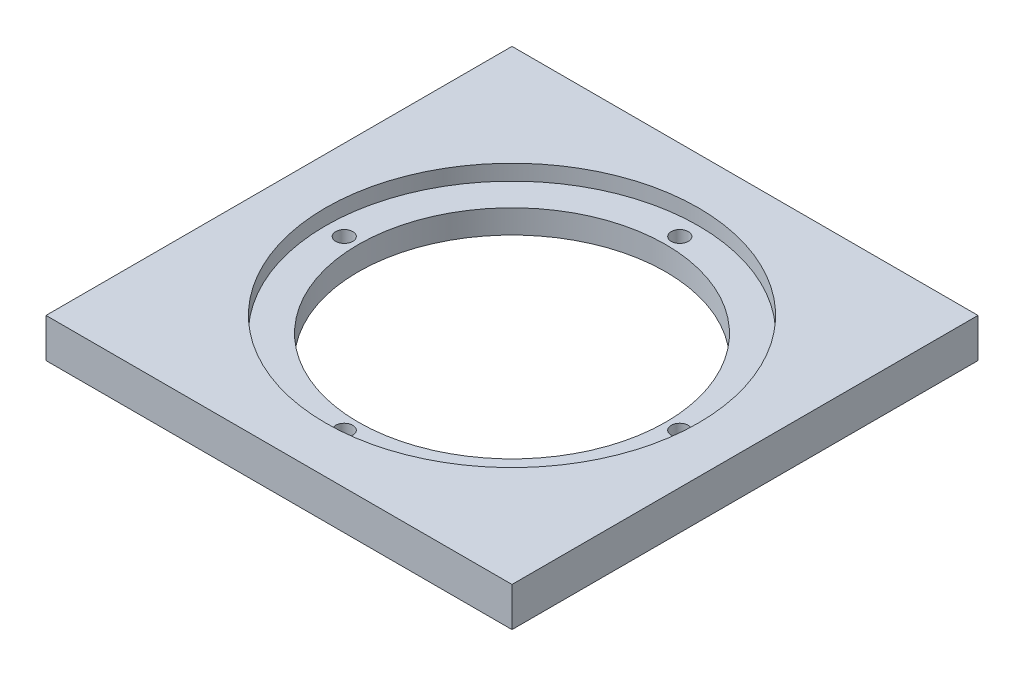
ISO-10303-21;
HEADER;
FILE_DESCRIPTION(('STEP AP214'),'2;1');
FILE_NAME('part.step','',(''),(''),'','','');
FILE_SCHEMA(('AUTOMOTIVE_DESIGN { 1 0 10303 214 1 1 1 1 }'));
ENDSEC;
DATA;
#1=APPLICATION_CONTEXT('core data for automotive mechanical design processes');
#2=APPLICATION_PROTOCOL_DEFINITION('international standard','automotive_design',2000,#1);
#3=PRODUCT_CONTEXT('',#1,'mechanical');
#4=PRODUCT('Part','Part','',(#3));
#5=PRODUCT_RELATED_PRODUCT_CATEGORY('part','',(#4));
#6=PRODUCT_DEFINITION_FORMATION('','',#4);
#7=PRODUCT_DEFINITION_CONTEXT('part definition',#1,'design');
#8=PRODUCT_DEFINITION('design','',#6,#7);
#9=PRODUCT_DEFINITION_SHAPE('','',#8);
#10=(LENGTH_UNIT() NAMED_UNIT(*) SI_UNIT(.MILLI.,.METRE.));
#11=(NAMED_UNIT(*) PLANE_ANGLE_UNIT() SI_UNIT($,.RADIAN.));
#12=(NAMED_UNIT(*) SI_UNIT($,.STERADIAN.) SOLID_ANGLE_UNIT());
#13=UNCERTAINTY_MEASURE_WITH_UNIT(LENGTH_MEASURE(1.E-05),#10,'distance_accuracy_value','');
#14=(GEOMETRIC_REPRESENTATION_CONTEXT(3) GLOBAL_UNCERTAINTY_ASSIGNED_CONTEXT((#13)) GLOBAL_UNIT_ASSIGNED_CONTEXT((#10,
#11,#12)) REPRESENTATION_CONTEXT('',''));
#15=CARTESIAN_POINT('',(0.,0.,0.));
#16=DIRECTION('',(0.,0.,1.));
#17=DIRECTION('',(1.,0.,0.));
#18=AXIS2_PLACEMENT_3D('',#15,#16,#17);
#19=CARTESIAN_POINT('',(0.,-12.5984,0.));
#20=DIRECTION('',(0.,1.,0.));
#21=DIRECTION('',(0.,0.,1.));
#22=AXIS2_PLACEMENT_3D('',#19,#20,#21);
#23=CYLINDRICAL_SURFACE('',#22,49.5);
#24=CARTESIAN_POINT('',(0.,-12.5984,0.));
#25=DIRECTION('',(0.,1.,0.));
#26=DIRECTION('',(0.,0.,1.));
#27=AXIS2_PLACEMENT_3D('',#24,#25,#26);
#28=CIRCLE('',#27,49.5);
#29=CARTESIAN_POINT('',(0.,-12.5984,49.5));
#30=VERTEX_POINT('',#29);
#31=EDGE_CURVE('E122',#30,#30,#28,.T.);
#32=ORIENTED_EDGE('',*,*,#31,.F.);
#33=EDGE_LOOP('',(#32));
#34=FACE_BOUND('',#33,.T.);
#35=CARTESIAN_POINT('',(0.,-5.,0.));
#36=DIRECTION('',(0.,1.,0.));
#37=DIRECTION('',(0.,0.,1.));
#38=AXIS2_PLACEMENT_3D('',#35,#36,#37);
#39=CIRCLE('',#38,49.5);
#40=CARTESIAN_POINT('',(0.,-5.,49.5));
#41=VERTEX_POINT('',#40);
#42=EDGE_CURVE('E134',#41,#41,#39,.F.);
#43=ORIENTED_EDGE('',*,*,#42,.F.);
#44=EDGE_LOOP('',(#43));
#45=FACE_BOUND('',#44,.T.);
#46=ADVANCED_FACE('F42',(#34,#45),#23,.F.);
#47=CARTESIAN_POINT('',(75.,-12.5984,75.));
#48=DIRECTION('',(1.,0.,0.));
#49=DIRECTION('',(0.,0.,-1.));
#50=AXIS2_PLACEMENT_3D('',#47,#48,#49);
#51=PLANE('',#50);
#52=DIRECTION('',(0.,0.,-1.));
#53=VECTOR('',#52,1.);
#54=CARTESIAN_POINT('',(75.,0.,75.));
#55=LINE('',#54,#53);
#56=CARTESIAN_POINT('',(75.,0.,75.));
#57=VERTEX_POINT('',#56);
#58=CARTESIAN_POINT('',(75.,0.,-75.0000000000001));
#59=VERTEX_POINT('',#58);
#60=EDGE_CURVE('E117',#57,#59,#55,.T.);
#61=ORIENTED_EDGE('',*,*,#60,.F.);
#62=DIRECTION('',(0.,1.,0.));
#63=VECTOR('',#62,1.);
#64=CARTESIAN_POINT('',(75.,-12.5984,75.));
#65=LINE('',#64,#63);
#66=CARTESIAN_POINT('',(75.,-12.5984,75.));
#67=VERTEX_POINT('',#66);
#68=EDGE_CURVE('E11',#67,#57,#65,.T.);
#69=ORIENTED_EDGE('',*,*,#68,.F.);
#70=DIRECTION('',(0.,0.,-1.));
#71=VECTOR('',#70,1.);
#72=CARTESIAN_POINT('',(75.,-12.5984,75.));
#73=LINE('',#72,#71);
#74=CARTESIAN_POINT('',(75.,-12.5984,-75.0000000000001));
#75=VERTEX_POINT('',#74);
#76=EDGE_CURVE('E107',#67,#75,#73,.T.);
#77=ORIENTED_EDGE('',*,*,#76,.T.);
#78=DIRECTION('',(0.,1.,0.));
#79=VECTOR('',#78,1.);
#80=CARTESIAN_POINT('',(75.,-12.5984,-75.0000000000001));
#81=LINE('',#80,#79);
#82=EDGE_CURVE('E87',#75,#59,#81,.T.);
#83=ORIENTED_EDGE('',*,*,#82,.T.);
#84=EDGE_LOOP('',(#61,#69,#77,#83));
#85=FACE_BOUND('',#84,.T.);
#86=ADVANCED_FACE('F44',(#85),#51,.T.);
#87=CARTESIAN_POINT('',(-75.,-12.5984,75.));
#88=DIRECTION('',(0.,0.,1.));
#89=DIRECTION('',(1.,0.,0.));
#90=AXIS2_PLACEMENT_3D('',#87,#88,#89);
#91=PLANE('',#90);
#92=DIRECTION('',(1.,0.,0.));
#93=VECTOR('',#92,1.);
#94=CARTESIAN_POINT('',(-75.,0.,75.));
#95=LINE('',#94,#93);
#96=CARTESIAN_POINT('',(-75.,0.,75.));
#97=VERTEX_POINT('',#96);
#98=EDGE_CURVE('E111',#97,#57,#95,.T.);
#99=ORIENTED_EDGE('',*,*,#98,.F.);
#100=DIRECTION('',(0.,1.,0.));
#101=VECTOR('',#100,1.);
#102=CARTESIAN_POINT('',(-75.,-12.5984,75.));
#103=LINE('',#102,#101);
#104=CARTESIAN_POINT('',(-75.,-12.5984,75.));
#105=VERTEX_POINT('',#104);
#106=EDGE_CURVE('E53',#105,#97,#103,.T.);
#107=ORIENTED_EDGE('',*,*,#106,.F.);
#108=DIRECTION('',(1.,0.,0.));
#109=VECTOR('',#108,1.);
#110=CARTESIAN_POINT('',(-75.,-12.5984,75.));
#111=LINE('',#110,#109);
#112=EDGE_CURVE('E102',#105,#67,#111,.T.);
#113=ORIENTED_EDGE('',*,*,#112,.T.);
#114=ORIENTED_EDGE('',*,*,#68,.T.);
#115=EDGE_LOOP('',(#99,#107,#113,#114));
#116=FACE_BOUND('',#115,.T.);
#117=ADVANCED_FACE('F202',(#116),#91,.T.);
#118=CARTESIAN_POINT('',(-75.,-12.5984,75.));
#119=DIRECTION('',(-1.,0.,0.));
#120=DIRECTION('',(0.,0.,1.));
#121=AXIS2_PLACEMENT_3D('',#118,#119,#120);
#122=PLANE('',#121);
#123=DIRECTION('',(0.,0.,1.));
#124=VECTOR('',#123,1.);
#125=CARTESIAN_POINT('',(-75.,0.,75.));
#126=LINE('',#125,#124);
#127=CARTESIAN_POINT('',(-74.9999999999999,0.,-75.));
#128=VERTEX_POINT('',#127);
#129=EDGE_CURVE('E95',#128,#97,#126,.T.);
#130=ORIENTED_EDGE('',*,*,#129,.F.);
#131=DIRECTION('',(0.,1.,0.));
#132=VECTOR('',#131,1.);
#133=CARTESIAN_POINT('',(-74.9999999999999,-12.5984,-75.));
#134=LINE('',#133,#132);
#135=CARTESIAN_POINT('',(-74.9999999999999,-12.5984,-75.));
#136=VERTEX_POINT('',#135);
#137=EDGE_CURVE('E90',#136,#128,#134,.T.);
#138=ORIENTED_EDGE('',*,*,#137,.F.);
#139=DIRECTION('',(0.,0.,1.));
#140=VECTOR('',#139,1.);
#141=CARTESIAN_POINT('',(-75.,-12.5984,75.));
#142=LINE('',#141,#140);
#143=EDGE_CURVE('E93',#136,#105,#142,.T.);
#144=ORIENTED_EDGE('',*,*,#143,.T.);
#145=ORIENTED_EDGE('',*,*,#106,.T.);
#146=EDGE_LOOP('',(#130,#138,#144,#145));
#147=FACE_BOUND('',#146,.T.);
#148=ADVANCED_FACE('F92',(#147),#122,.T.);
#149=CARTESIAN_POINT('',(-74.9999999999999,-12.5984,-75.));
#150=DIRECTION('',(0.,0.,-1.));
#151=DIRECTION('',(-1.,0.,0.));
#152=AXIS2_PLACEMENT_3D('',#149,#150,#151);
#153=PLANE('',#152);
#154=DIRECTION('',(-1.,0.,0.));
#155=VECTOR('',#154,1.);
#156=CARTESIAN_POINT('',(-74.9999999999999,0.,-75.));
#157=LINE('',#156,#155);
#158=EDGE_CURVE('E121',#59,#128,#157,.T.);
#159=ORIENTED_EDGE('',*,*,#158,.F.);
#160=ORIENTED_EDGE('',*,*,#82,.F.);
#161=DIRECTION('',(-1.,0.,0.));
#162=VECTOR('',#161,1.);
#163=CARTESIAN_POINT('',(-74.9999999999999,-12.5984,-75.));
#164=LINE('',#163,#162);
#165=EDGE_CURVE('E101',#75,#136,#164,.T.);
#166=ORIENTED_EDGE('',*,*,#165,.T.);
#167=ORIENTED_EDGE('',*,*,#137,.T.);
#168=EDGE_LOOP('',(#159,#160,#166,#167));
#169=FACE_BOUND('',#168,.T.);
#170=ADVANCED_FACE('F105',(#169),#153,.T.);
#171=CARTESIAN_POINT('',(0.,-12.5984,0.));
#172=DIRECTION('',(0.,-1.,0.));
#173=DIRECTION('',(0.,0.,-1.));
#174=AXIS2_PLACEMENT_3D('',#171,#172,#173);
#175=PLANE('',#174);
#176=CARTESIAN_POINT('',(-54.,-12.5984,0.));
#177=DIRECTION('',(0.,1.,0.));
#178=DIRECTION('',(0.,0.,1.));
#179=AXIS2_PLACEMENT_3D('',#176,#177,#178);
#180=CIRCLE('',#179,2.75);
#181=CARTESIAN_POINT('',(-54.,-12.5984,2.75000000000001));
#182=VERTEX_POINT('',#181);
#183=EDGE_CURVE('E144',#182,#182,#180,.T.);
#184=ORIENTED_EDGE('',*,*,#183,.T.);
#185=EDGE_LOOP('',(#184));
#186=FACE_BOUND('',#185,.T.);
#187=CARTESIAN_POINT('',(2.4980018054066E-13,-12.5984,-54.));
#188=DIRECTION('',(0.,1.,0.));
#189=DIRECTION('',(0.,0.,1.));
#190=AXIS2_PLACEMENT_3D('',#187,#188,#189);
#191=CIRCLE('',#190,2.75);
#192=CARTESIAN_POINT('',(2.49189557877116E-13,-12.5984,-51.25));
#193=VERTEX_POINT('',#192);
#194=EDGE_CURVE('E279',#193,#193,#191,.T.);
#195=ORIENTED_EDGE('',*,*,#194,.T.);
#196=EDGE_LOOP('',(#195));
#197=FACE_BOUND('',#196,.T.);
#198=CARTESIAN_POINT('',(54.,-12.5984,3.88578058618805E-13));
#199=DIRECTION('',(0.,1.,0.));
#200=DIRECTION('',(0.,0.,1.));
#201=AXIS2_PLACEMENT_3D('',#198,#199,#200);
#202=CIRCLE('',#201,2.75);
#203=CARTESIAN_POINT('',(54.,-12.5984,2.75000000000039));
#204=VERTEX_POINT('',#203);
#205=EDGE_CURVE('E284',#204,#204,#202,.T.);
#206=ORIENTED_EDGE('',*,*,#205,.T.);
#207=EDGE_LOOP('',(#206));
#208=FACE_BOUND('',#207,.T.);
#209=CARTESIAN_POINT('',(-5.55111512312578E-13,-12.5984,54.));
#210=DIRECTION('',(0.,1.,0.));
#211=DIRECTION('',(0.,0.,1.));
#212=AXIS2_PLACEMENT_3D('',#209,#210,#211);
#213=CIRCLE('',#212,2.75);
#214=CARTESIAN_POINT('',(-5.55722134976122E-13,-12.5984,56.75));
#215=VERTEX_POINT('',#214);
#216=EDGE_CURVE('E289',#215,#215,#213,.T.);
#217=ORIENTED_EDGE('',*,*,#216,.T.);
#218=EDGE_LOOP('',(#217));
#219=FACE_BOUND('',#218,.T.);
#220=ORIENTED_EDGE('',*,*,#31,.T.);
#221=EDGE_LOOP('',(#220));
#222=FACE_BOUND('',#221,.T.);
#223=ORIENTED_EDGE('',*,*,#76,.F.);
#224=ORIENTED_EDGE('',*,*,#112,.F.);
#225=ORIENTED_EDGE('',*,*,#143,.F.);
#226=ORIENTED_EDGE('',*,*,#165,.F.);
#227=EDGE_LOOP('',(#223,#224,#225,#226));
#228=FACE_BOUND('',#227,.T.);
#229=ADVANCED_FACE('F100',(#186,#197,#208,#219,#222,#228),#175,.T.);
#230=CARTESIAN_POINT('',(0.,0.,0.));
#231=DIRECTION('',(0.,-1.,0.));
#232=DIRECTION('',(0.,0.,-1.));
#233=AXIS2_PLACEMENT_3D('',#230,#231,#232);
#234=PLANE('',#233);
#235=CARTESIAN_POINT('',(0.,0.,0.));
#236=DIRECTION('',(0.,1.,0.));
#237=DIRECTION('',(0.,0.,1.));
#238=AXIS2_PLACEMENT_3D('',#235,#236,#237);
#239=CIRCLE('',#238,60.);
#240=CARTESIAN_POINT('',(0.,0.,60.));
#241=VERTEX_POINT('',#240);
#242=EDGE_CURVE('E155',#241,#241,#239,.T.);
#243=ORIENTED_EDGE('',*,*,#242,.F.);
#244=EDGE_LOOP('',(#243));
#245=FACE_BOUND('',#244,.T.);
#246=ORIENTED_EDGE('',*,*,#60,.T.);
#247=ORIENTED_EDGE('',*,*,#158,.T.);
#248=ORIENTED_EDGE('',*,*,#129,.T.);
#249=ORIENTED_EDGE('',*,*,#98,.T.);
#250=EDGE_LOOP('',(#246,#247,#248,#249));
#251=FACE_BOUND('',#250,.T.);
#252=ADVANCED_FACE('F183',(#245,#251),#234,.F.);
#253=CARTESIAN_POINT('',(0.,-5.00000000000001,0.));
#254=DIRECTION('',(0.,1.,0.));
#255=DIRECTION('',(0.,0.,1.));
#256=AXIS2_PLACEMENT_3D('',#253,#254,#255);
#257=PLANE('',#256);
#258=CARTESIAN_POINT('',(-54.,-5.,0.));
#259=DIRECTION('',(0.,1.,0.));
#260=DIRECTION('',(0.,0.,1.));
#261=AXIS2_PLACEMENT_3D('',#258,#259,#260);
#262=CIRCLE('',#261,2.75);
#263=CARTESIAN_POINT('',(-54.,-5.,2.75));
#264=VERTEX_POINT('',#263);
#265=EDGE_CURVE('E46',#264,#264,#262,.T.);
#266=ORIENTED_EDGE('',*,*,#265,.F.);
#267=EDGE_LOOP('',(#266));
#268=FACE_BOUND('',#267,.T.);
#269=CARTESIAN_POINT('',(2.4980018054066E-13,-5.00000000000001,-54.));
#270=DIRECTION('',(0.,1.,0.));
#271=DIRECTION('',(0.,0.,1.));
#272=AXIS2_PLACEMENT_3D('',#269,#270,#271);
#273=CIRCLE('',#272,2.75);
#274=CARTESIAN_POINT('',(2.49189557877116E-13,-5.00000000000001,-51.25));
#275=VERTEX_POINT('',#274);
#276=EDGE_CURVE('E147',#275,#275,#273,.T.);
#277=ORIENTED_EDGE('',*,*,#276,.F.);
#278=EDGE_LOOP('',(#277));
#279=FACE_BOUND('',#278,.T.);
#280=CARTESIAN_POINT('',(54.,-5.00000000000001,3.88578058618805E-13));
#281=DIRECTION('',(0.,1.,0.));
#282=DIRECTION('',(0.,0.,1.));
#283=AXIS2_PLACEMENT_3D('',#280,#281,#282);
#284=CIRCLE('',#283,2.75);
#285=CARTESIAN_POINT('',(54.,-5.00000000000001,2.75000000000039));
#286=VERTEX_POINT('',#285);
#287=EDGE_CURVE('E143',#286,#286,#284,.T.);
#288=ORIENTED_EDGE('',*,*,#287,.F.);
#289=EDGE_LOOP('',(#288));
#290=FACE_BOUND('',#289,.T.);
#291=CARTESIAN_POINT('',(-5.55111512312578E-13,-5.00000000000001,54.));
#292=DIRECTION('',(0.,1.,0.));
#293=DIRECTION('',(0.,0.,1.));
#294=AXIS2_PLACEMENT_3D('',#291,#292,#293);
#295=CIRCLE('',#294,2.75);
#296=CARTESIAN_POINT('',(-5.55722134976122E-13,-5.00000000000001,56.75));
#297=VERTEX_POINT('',#296);
#298=EDGE_CURVE('E139',#297,#297,#295,.T.);
#299=ORIENTED_EDGE('',*,*,#298,.F.);
#300=EDGE_LOOP('',(#299));
#301=FACE_BOUND('',#300,.T.);
#302=CARTESIAN_POINT('',(0.,-5.00000000000001,0.));
#303=DIRECTION('',(0.,1.,0.));
#304=DIRECTION('',(0.,0.,1.));
#305=AXIS2_PLACEMENT_3D('',#302,#303,#304);
#306=CIRCLE('',#305,60.);
#307=CARTESIAN_POINT('',(0.,-5.00000000000001,60.));
#308=VERTEX_POINT('',#307);
#309=EDGE_CURVE('E138',#308,#308,#306,.T.);
#310=ORIENTED_EDGE('',*,*,#309,.T.);
#311=EDGE_LOOP('',(#310));
#312=FACE_BOUND('',#311,.T.);
#313=ORIENTED_EDGE('',*,*,#42,.T.);
#314=EDGE_LOOP('',(#313));
#315=FACE_BOUND('',#314,.T.);
#316=ADVANCED_FACE('F180',(#268,#279,#290,#301,#312,#315),#257,.T.);
#317=CARTESIAN_POINT('',(0.,-5.00000000000001,0.));
#318=DIRECTION('',(0.,1.,0.));
#319=DIRECTION('',(0.,0.,1.));
#320=AXIS2_PLACEMENT_3D('',#317,#318,#319);
#321=CYLINDRICAL_SURFACE('',#320,60.);
#322=ORIENTED_EDGE('',*,*,#309,.F.);
#323=EDGE_LOOP('',(#322));
#324=FACE_BOUND('',#323,.T.);
#325=ORIENTED_EDGE('',*,*,#242,.T.);
#326=EDGE_LOOP('',(#325));
#327=FACE_BOUND('',#326,.T.);
#328=ADVANCED_FACE('F182',(#324,#327),#321,.F.);
#329=CARTESIAN_POINT('',(-5.55111512312578E-13,-12.5984,54.));
#330=DIRECTION('',(0.,1.,0.));
#331=DIRECTION('',(0.,0.,1.));
#332=AXIS2_PLACEMENT_3D('',#329,#330,#331);
#333=CYLINDRICAL_SURFACE('',#332,2.75);
#334=ORIENTED_EDGE('',*,*,#298,.T.);
#335=EDGE_LOOP('',(#334));
#336=FACE_BOUND('',#335,.T.);
#337=ORIENTED_EDGE('',*,*,#216,.F.);
#338=EDGE_LOOP('',(#337));
#339=FACE_BOUND('',#338,.T.);
#340=ADVANCED_FACE('F190',(#336,#339),#333,.F.);
#341=CARTESIAN_POINT('',(54.,-12.5984,3.88578058618805E-13));
#342=DIRECTION('',(0.,1.,0.));
#343=DIRECTION('',(0.,0.,1.));
#344=AXIS2_PLACEMENT_3D('',#341,#342,#343);
#345=CYLINDRICAL_SURFACE('',#344,2.75);
#346=ORIENTED_EDGE('',*,*,#287,.T.);
#347=EDGE_LOOP('',(#346));
#348=FACE_BOUND('',#347,.T.);
#349=ORIENTED_EDGE('',*,*,#205,.F.);
#350=EDGE_LOOP('',(#349));
#351=FACE_BOUND('',#350,.T.);
#352=ADVANCED_FACE('F246',(#348,#351),#345,.F.);
#353=CARTESIAN_POINT('',(2.4980018054066E-13,-12.5984,-54.));
#354=DIRECTION('',(0.,1.,0.));
#355=DIRECTION('',(0.,0.,1.));
#356=AXIS2_PLACEMENT_3D('',#353,#354,#355);
#357=CYLINDRICAL_SURFACE('',#356,2.75);
#358=ORIENTED_EDGE('',*,*,#276,.T.);
#359=EDGE_LOOP('',(#358));
#360=FACE_BOUND('',#359,.T.);
#361=ORIENTED_EDGE('',*,*,#194,.F.);
#362=EDGE_LOOP('',(#361));
#363=FACE_BOUND('',#362,.T.);
#364=ADVANCED_FACE('F255',(#360,#363),#357,.F.);
#365=CARTESIAN_POINT('',(-54.,-12.5984,0.));
#366=DIRECTION('',(0.,1.,0.));
#367=DIRECTION('',(0.,0.,1.));
#368=AXIS2_PLACEMENT_3D('',#365,#366,#367);
#369=CYLINDRICAL_SURFACE('',#368,2.75);
#370=ORIENTED_EDGE('',*,*,#265,.T.);
#371=EDGE_LOOP('',(#370));
#372=FACE_BOUND('',#371,.T.);
#373=ORIENTED_EDGE('',*,*,#183,.F.);
#374=EDGE_LOOP('',(#373));
#375=FACE_BOUND('',#374,.T.);
#376=ADVANCED_FACE('F264',(#372,#375),#369,.F.);
#377=CLOSED_SHELL('',(#46,#86,#117,#148,#170,#229,#252,#316,#328,#340,#352,#364,#376));
#378=MANIFOLD_SOLID_BREP('B2',#377);
#379=ADVANCED_BREP_SHAPE_REPRESENTATION('',(#18,#378),#14);
#380=SHAPE_DEFINITION_REPRESENTATION(#9,#379);
ENDSEC;
END-ISO-10303-21;
